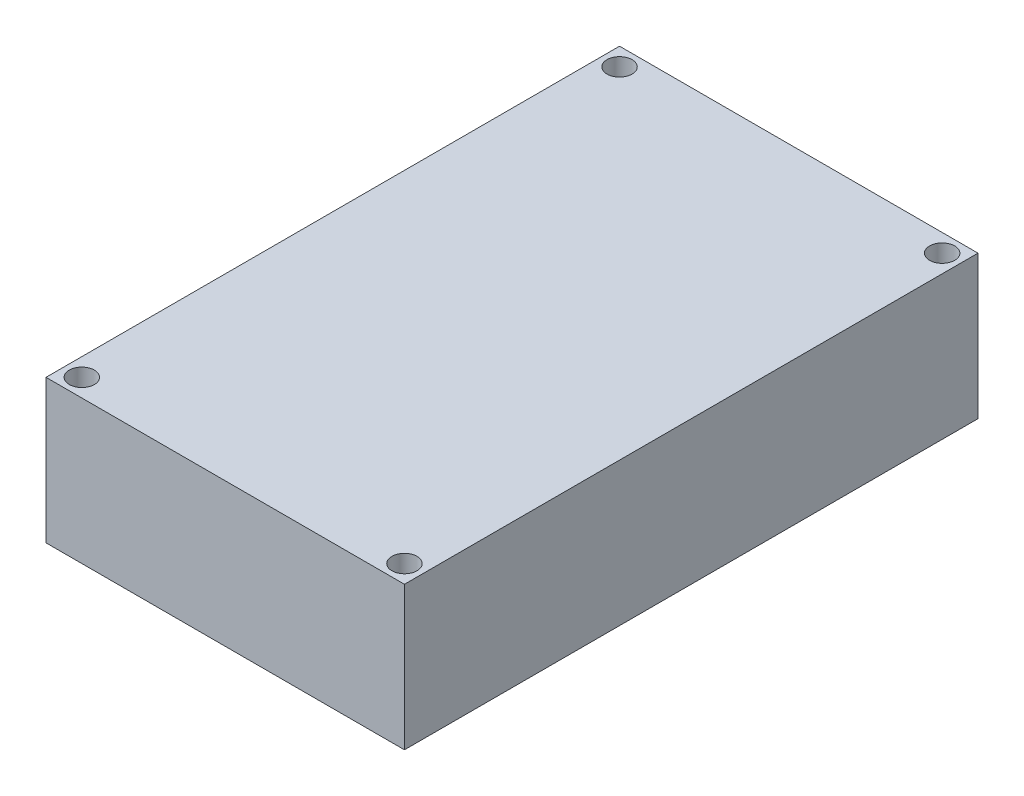
ISO-10303-21;
HEADER;
FILE_DESCRIPTION(('STEP AP214'),'2;1');
FILE_NAME('part.step','',(''),(''),'','','');
FILE_SCHEMA(('AUTOMOTIVE_DESIGN { 1 0 10303 214 1 1 1 1 }'));
ENDSEC;
DATA;
#1=APPLICATION_CONTEXT('core data for automotive mechanical design processes');
#2=APPLICATION_PROTOCOL_DEFINITION('international standard','automotive_design',2000,#1);
#3=PRODUCT_CONTEXT('',#1,'mechanical');
#4=PRODUCT('Part','Part','',(#3));
#5=PRODUCT_RELATED_PRODUCT_CATEGORY('part','',(#4));
#6=PRODUCT_DEFINITION_FORMATION('','',#4);
#7=PRODUCT_DEFINITION_CONTEXT('part definition',#1,'design');
#8=PRODUCT_DEFINITION('design','',#6,#7);
#9=PRODUCT_DEFINITION_SHAPE('','',#8);
#10=(LENGTH_UNIT() NAMED_UNIT(*) SI_UNIT(.MILLI.,.METRE.));
#11=(NAMED_UNIT(*) PLANE_ANGLE_UNIT() SI_UNIT($,.RADIAN.));
#12=(NAMED_UNIT(*) SI_UNIT($,.STERADIAN.) SOLID_ANGLE_UNIT());
#13=UNCERTAINTY_MEASURE_WITH_UNIT(LENGTH_MEASURE(1.E-05),#10,'distance_accuracy_value','');
#14=(GEOMETRIC_REPRESENTATION_CONTEXT(3) GLOBAL_UNCERTAINTY_ASSIGNED_CONTEXT((#13)) GLOBAL_UNIT_ASSIGNED_CONTEXT((#10,
#11,#12)) REPRESENTATION_CONTEXT('',''));
#15=CARTESIAN_POINT('',(0.,0.,0.));
#16=DIRECTION('',(0.,0.,1.));
#17=DIRECTION('',(1.,0.,0.));
#18=AXIS2_PLACEMENT_3D('',#15,#16,#17);
#19=CARTESIAN_POINT('',(0.,20.,0.));
#20=DIRECTION('',(0.,1.,0.));
#21=DIRECTION('',(0.,0.,1.));
#22=AXIS2_PLACEMENT_3D('',#19,#20,#21);
#23=PLANE('',#22);
#24=CARTESIAN_POINT('',(-4.05936675461743,20.,54.6031662269129));
#25=DIRECTION('',(0.,1.,0.));
#26=DIRECTION('',(0.,0.,1.));
#27=AXIS2_PLACEMENT_3D('',#24,#25,#26);
#28=CIRCLE('',#27,1.75);
#29=CARTESIAN_POINT('',(-4.05936675461743,20.,56.3531662269129));
#30=VERTEX_POINT('',#29);
#31=EDGE_CURVE('E124',#30,#30,#28,.T.);
#32=ORIENTED_EDGE('',*,*,#31,.F.);
#33=EDGE_LOOP('',(#32));
#34=FACE_BOUND('',#33,.T.);
#35=CARTESIAN_POINT('',(40.9406332453826,20.,-20.3968337730871));
#36=DIRECTION('',(0.,1.,0.));
#37=DIRECTION('',(0.,0.,1.));
#38=AXIS2_PLACEMENT_3D('',#35,#36,#37);
#39=CIRCLE('',#38,1.75);
#40=CARTESIAN_POINT('',(40.9406332453826,20.,-18.6468337730871));
#41=VERTEX_POINT('',#40);
#42=EDGE_CURVE('E103',#41,#41,#39,.T.);
#43=ORIENTED_EDGE('',*,*,#42,.F.);
#44=EDGE_LOOP('',(#43));
#45=FACE_BOUND('',#44,.T.);
#46=DIRECTION('',(0.,0.,1.));
#47=VECTOR('',#46,1.);
#48=CARTESIAN_POINT('',(-6.55936675461744,20.,-22.8968337730871));
#49=LINE('',#48,#47);
#50=CARTESIAN_POINT('',(-6.55936675461744,20.,-22.8968337730871));
#51=VERTEX_POINT('',#50);
#52=CARTESIAN_POINT('',(-6.55936675461743,20.,57.1031662269129));
#53=VERTEX_POINT('',#52);
#54=EDGE_CURVE('E88',#51,#53,#49,.T.);
#55=ORIENTED_EDGE('',*,*,#54,.T.);
#56=DIRECTION('',(1.,0.,0.));
#57=VECTOR('',#56,1.);
#58=CARTESIAN_POINT('',(-6.55936675461743,20.,57.1031662269129));
#59=LINE('',#58,#57);
#60=CARTESIAN_POINT('',(43.4406332453826,20.,57.1031662269129));
#61=VERTEX_POINT('',#60);
#62=EDGE_CURVE('E83',#53,#61,#59,.T.);
#63=ORIENTED_EDGE('',*,*,#62,.T.);
#64=DIRECTION('',(0.,0.,-1.));
#65=VECTOR('',#64,1.);
#66=CARTESIAN_POINT('',(43.4406332453826,20.,-22.8968337730871));
#67=LINE('',#66,#65);
#68=CARTESIAN_POINT('',(43.4406332453826,20.,-22.8968337730871));
#69=VERTEX_POINT('',#68);
#70=EDGE_CURVE('E86',#61,#69,#67,.T.);
#71=ORIENTED_EDGE('',*,*,#70,.T.);
#72=DIRECTION('',(-1.,0.,0.));
#73=VECTOR('',#72,1.);
#74=CARTESIAN_POINT('',(-6.55936675461744,20.,-22.8968337730871));
#75=LINE('',#74,#73);
#76=EDGE_CURVE('E53',#69,#51,#75,.T.);
#77=ORIENTED_EDGE('',*,*,#76,.T.);
#78=EDGE_LOOP('',(#55,#63,#71,#77));
#79=FACE_BOUND('',#78,.T.);
#80=CARTESIAN_POINT('',(-4.05936675461743,20.,-20.3968337730871));
#81=DIRECTION('',(0.,1.,0.));
#82=DIRECTION('',(0.,0.,1.));
#83=AXIS2_PLACEMENT_3D('',#80,#81,#82);
#84=CIRCLE('',#83,1.75);
#85=CARTESIAN_POINT('',(-4.05936675461743,20.,-18.6468337730871));
#86=VERTEX_POINT('',#85);
#87=EDGE_CURVE('E118',#86,#86,#84,.T.);
#88=ORIENTED_EDGE('',*,*,#87,.F.);
#89=EDGE_LOOP('',(#88));
#90=FACE_BOUND('',#89,.T.);
#91=CARTESIAN_POINT('',(40.9406332453826,20.,54.6031662269129));
#92=DIRECTION('',(0.,1.,0.));
#93=DIRECTION('',(0.,0.,1.));
#94=AXIS2_PLACEMENT_3D('',#91,#92,#93);
#95=CIRCLE('',#94,1.75);
#96=CARTESIAN_POINT('',(40.9406332453826,20.,56.3531662269129));
#97=VERTEX_POINT('',#96);
#98=EDGE_CURVE('E130',#97,#97,#95,.T.);
#99=ORIENTED_EDGE('',*,*,#98,.F.);
#100=EDGE_LOOP('',(#99));
#101=FACE_BOUND('',#100,.T.);
#102=ADVANCED_FACE('F36',(#34,#45,#79,#90,#101),#23,.T.);
#103=CARTESIAN_POINT('',(0.,0.,0.));
#104=DIRECTION('',(0.,1.,0.));
#105=DIRECTION('',(0.,0.,1.));
#106=AXIS2_PLACEMENT_3D('',#103,#104,#105);
#107=PLANE('',#106);
#108=DIRECTION('',(0.,0.,1.));
#109=VECTOR('',#108,1.);
#110=CARTESIAN_POINT('',(-6.55936675461744,0.,-22.8968337730871));
#111=LINE('',#110,#109);
#112=CARTESIAN_POINT('',(-6.55936675461744,0.,-22.8968337730871));
#113=VERTEX_POINT('',#112);
#114=CARTESIAN_POINT('',(-6.55936675461743,0.,57.1031662269129));
#115=VERTEX_POINT('',#114);
#116=EDGE_CURVE('E100',#113,#115,#111,.T.);
#117=ORIENTED_EDGE('',*,*,#116,.F.);
#118=DIRECTION('',(-1.,0.,0.));
#119=VECTOR('',#118,1.);
#120=CARTESIAN_POINT('',(-6.55936675461744,0.,-22.8968337730871));
#121=LINE('',#120,#119);
#122=CARTESIAN_POINT('',(43.4406332453826,0.,-22.8968337730871));
#123=VERTEX_POINT('',#122);
#124=EDGE_CURVE('E76',#123,#113,#121,.T.);
#125=ORIENTED_EDGE('',*,*,#124,.F.);
#126=DIRECTION('',(0.,0.,-1.));
#127=VECTOR('',#126,1.);
#128=CARTESIAN_POINT('',(43.4406332453826,0.,-22.8968337730871));
#129=LINE('',#128,#127);
#130=CARTESIAN_POINT('',(43.4406332453826,0.,57.1031662269129));
#131=VERTEX_POINT('',#130);
#132=EDGE_CURVE('E70',#131,#123,#129,.T.);
#133=ORIENTED_EDGE('',*,*,#132,.F.);
#134=DIRECTION('',(1.,0.,0.));
#135=VECTOR('',#134,1.);
#136=CARTESIAN_POINT('',(-6.55936675461743,0.,57.1031662269129));
#137=LINE('',#136,#135);
#138=EDGE_CURVE('E92',#115,#131,#137,.T.);
#139=ORIENTED_EDGE('',*,*,#138,.F.);
#140=EDGE_LOOP('',(#117,#125,#133,#139));
#141=FACE_BOUND('',#140,.T.);
#142=CARTESIAN_POINT('',(40.9406332453826,0.,-20.3968337730871));
#143=DIRECTION('',(0.,1.,0.));
#144=DIRECTION('',(0.,0.,1.));
#145=AXIS2_PLACEMENT_3D('',#142,#143,#144);
#146=CIRCLE('',#145,1.75);
#147=CARTESIAN_POINT('',(40.9406332453826,0.,-18.6468337730871));
#148=VERTEX_POINT('',#147);
#149=EDGE_CURVE('E115',#148,#148,#146,.T.);
#150=ORIENTED_EDGE('',*,*,#149,.T.);
#151=EDGE_LOOP('',(#150));
#152=FACE_BOUND('',#151,.T.);
#153=CARTESIAN_POINT('',(-4.05936675461743,0.,-20.3968337730871));
#154=DIRECTION('',(0.,1.,0.));
#155=DIRECTION('',(0.,0.,1.));
#156=AXIS2_PLACEMENT_3D('',#153,#154,#155);
#157=CIRCLE('',#156,1.75);
#158=CARTESIAN_POINT('',(-4.05936675461743,0.,-18.6468337730871));
#159=VERTEX_POINT('',#158);
#160=EDGE_CURVE('E121',#159,#159,#157,.T.);
#161=ORIENTED_EDGE('',*,*,#160,.T.);
#162=EDGE_LOOP('',(#161));
#163=FACE_BOUND('',#162,.T.);
#164=CARTESIAN_POINT('',(-4.05936675461743,0.,54.6031662269129));
#165=DIRECTION('',(0.,1.,0.));
#166=DIRECTION('',(0.,0.,1.));
#167=AXIS2_PLACEMENT_3D('',#164,#165,#166);
#168=CIRCLE('',#167,1.75);
#169=CARTESIAN_POINT('',(-4.05936675461743,0.,56.3531662269129));
#170=VERTEX_POINT('',#169);
#171=EDGE_CURVE('E127',#170,#170,#168,.T.);
#172=ORIENTED_EDGE('',*,*,#171,.T.);
#173=EDGE_LOOP('',(#172));
#174=FACE_BOUND('',#173,.T.);
#175=CARTESIAN_POINT('',(40.9406332453826,0.,54.6031662269129));
#176=DIRECTION('',(0.,1.,0.));
#177=DIRECTION('',(0.,0.,1.));
#178=AXIS2_PLACEMENT_3D('',#175,#176,#177);
#179=CIRCLE('',#178,1.75);
#180=CARTESIAN_POINT('',(40.9406332453826,0.,56.3531662269129));
#181=VERTEX_POINT('',#180);
#182=EDGE_CURVE('E133',#181,#181,#179,.T.);
#183=ORIENTED_EDGE('',*,*,#182,.T.);
#184=EDGE_LOOP('',(#183));
#185=FACE_BOUND('',#184,.T.);
#186=ADVANCED_FACE('F111',(#141,#152,#163,#174,#185),#107,.F.);
#187=CARTESIAN_POINT('',(-6.55936675461744,20.,-22.8968337730871));
#188=DIRECTION('',(1.,0.,0.));
#189=DIRECTION('',(0.,0.,-1.));
#190=AXIS2_PLACEMENT_3D('',#187,#188,#189);
#191=PLANE('',#190);
#192=ORIENTED_EDGE('',*,*,#116,.T.);
#193=DIRECTION('',(0.,-1.,0.));
#194=VECTOR('',#193,1.);
#195=CARTESIAN_POINT('',(-6.55936675461743,20.,57.1031662269129));
#196=LINE('',#195,#194);
#197=EDGE_CURVE('E11',#53,#115,#196,.T.);
#198=ORIENTED_EDGE('',*,*,#197,.F.);
#199=ORIENTED_EDGE('',*,*,#54,.F.);
#200=DIRECTION('',(0.,-1.,0.));
#201=VECTOR('',#200,1.);
#202=CARTESIAN_POINT('',(-6.55936675461744,20.,-22.8968337730871));
#203=LINE('',#202,#201);
#204=EDGE_CURVE('E96',#51,#113,#203,.T.);
#205=ORIENTED_EDGE('',*,*,#204,.T.);
#206=EDGE_LOOP('',(#192,#198,#199,#205));
#207=FACE_BOUND('',#206,.T.);
#208=ADVANCED_FACE('F38',(#207),#191,.F.);
#209=CARTESIAN_POINT('',(-6.55936675461743,20.,57.1031662269129));
#210=DIRECTION('',(0.,0.,-1.));
#211=DIRECTION('',(-1.,0.,0.));
#212=AXIS2_PLACEMENT_3D('',#209,#210,#211);
#213=PLANE('',#212);
#214=ORIENTED_EDGE('',*,*,#138,.T.);
#215=DIRECTION('',(0.,-1.,0.));
#216=VECTOR('',#215,1.);
#217=CARTESIAN_POINT('',(43.4406332453826,20.,57.1031662269129));
#218=LINE('',#217,#216);
#219=EDGE_CURVE('E45',#61,#131,#218,.T.);
#220=ORIENTED_EDGE('',*,*,#219,.F.);
#221=ORIENTED_EDGE('',*,*,#62,.F.);
#222=ORIENTED_EDGE('',*,*,#197,.T.);
#223=EDGE_LOOP('',(#214,#220,#221,#222));
#224=FACE_BOUND('',#223,.T.);
#225=ADVANCED_FACE('F91',(#224),#213,.F.);
#226=CARTESIAN_POINT('',(43.4406332453826,20.,-22.8968337730871));
#227=DIRECTION('',(-1.,0.,0.));
#228=DIRECTION('',(0.,0.,1.));
#229=AXIS2_PLACEMENT_3D('',#226,#227,#228);
#230=PLANE('',#229);
#231=ORIENTED_EDGE('',*,*,#132,.T.);
#232=DIRECTION('',(0.,-1.,0.));
#233=VECTOR('',#232,1.);
#234=CARTESIAN_POINT('',(43.4406332453826,20.,-22.8968337730871));
#235=LINE('',#234,#233);
#236=EDGE_CURVE('E93',#69,#123,#235,.T.);
#237=ORIENTED_EDGE('',*,*,#236,.F.);
#238=ORIENTED_EDGE('',*,*,#70,.F.);
#239=ORIENTED_EDGE('',*,*,#219,.T.);
#240=EDGE_LOOP('',(#231,#237,#238,#239));
#241=FACE_BOUND('',#240,.T.);
#242=ADVANCED_FACE('F94',(#241),#230,.F.);
#243=CARTESIAN_POINT('',(-6.55936675461744,20.,-22.8968337730871));
#244=DIRECTION('',(0.,0.,1.));
#245=DIRECTION('',(1.,0.,0.));
#246=AXIS2_PLACEMENT_3D('',#243,#244,#245);
#247=PLANE('',#246);
#248=ORIENTED_EDGE('',*,*,#124,.T.);
#249=ORIENTED_EDGE('',*,*,#204,.F.);
#250=ORIENTED_EDGE('',*,*,#76,.F.);
#251=ORIENTED_EDGE('',*,*,#236,.T.);
#252=EDGE_LOOP('',(#248,#249,#250,#251));
#253=FACE_BOUND('',#252,.T.);
#254=ADVANCED_FACE('F108',(#253),#247,.F.);
#255=CARTESIAN_POINT('',(40.9406332453826,20.,-20.3968337730871));
#256=DIRECTION('',(0.,-1.,0.));
#257=DIRECTION('',(0.,0.,-1.));
#258=AXIS2_PLACEMENT_3D('',#255,#256,#257);
#259=CYLINDRICAL_SURFACE('',#258,1.75);
#260=ORIENTED_EDGE('',*,*,#42,.T.);
#261=EDGE_LOOP('',(#260));
#262=FACE_BOUND('',#261,.T.);
#263=ORIENTED_EDGE('',*,*,#149,.F.);
#264=EDGE_LOOP('',(#263));
#265=FACE_BOUND('',#264,.T.);
#266=ADVANCED_FACE('F152',(#262,#265),#259,.F.);
#267=CARTESIAN_POINT('',(-4.05936675461743,20.,-20.3968337730871));
#268=DIRECTION('',(0.,-1.,0.));
#269=DIRECTION('',(0.,0.,-1.));
#270=AXIS2_PLACEMENT_3D('',#267,#268,#269);
#271=CYLINDRICAL_SURFACE('',#270,1.75);
#272=ORIENTED_EDGE('',*,*,#87,.T.);
#273=EDGE_LOOP('',(#272));
#274=FACE_BOUND('',#273,.T.);
#275=ORIENTED_EDGE('',*,*,#160,.F.);
#276=EDGE_LOOP('',(#275));
#277=FACE_BOUND('',#276,.T.);
#278=ADVANCED_FACE('F198',(#274,#277),#271,.F.);
#279=CARTESIAN_POINT('',(-4.05936675461743,20.,54.6031662269129));
#280=DIRECTION('',(0.,-1.,0.));
#281=DIRECTION('',(0.,0.,-1.));
#282=AXIS2_PLACEMENT_3D('',#279,#280,#281);
#283=CYLINDRICAL_SURFACE('',#282,1.75);
#284=ORIENTED_EDGE('',*,*,#31,.T.);
#285=EDGE_LOOP('',(#284));
#286=FACE_BOUND('',#285,.T.);
#287=ORIENTED_EDGE('',*,*,#171,.F.);
#288=EDGE_LOOP('',(#287));
#289=FACE_BOUND('',#288,.T.);
#290=ADVANCED_FACE('F206',(#286,#289),#283,.F.);
#291=CARTESIAN_POINT('',(40.9406332453826,20.,54.6031662269129));
#292=DIRECTION('',(0.,-1.,0.));
#293=DIRECTION('',(0.,0.,-1.));
#294=AXIS2_PLACEMENT_3D('',#291,#292,#293);
#295=CYLINDRICAL_SURFACE('',#294,1.75);
#296=ORIENTED_EDGE('',*,*,#98,.T.);
#297=EDGE_LOOP('',(#296));
#298=FACE_BOUND('',#297,.T.);
#299=ORIENTED_EDGE('',*,*,#182,.F.);
#300=EDGE_LOOP('',(#299));
#301=FACE_BOUND('',#300,.T.);
#302=ADVANCED_FACE('F139',(#298,#301),#295,.F.);
#303=CLOSED_SHELL('',(#102,#186,#208,#225,#242,#254,#266,#278,#290,#302));
#304=MANIFOLD_SOLID_BREP('B2',#303);
#305=ADVANCED_BREP_SHAPE_REPRESENTATION('',(#18,#304),#14);
#306=SHAPE_DEFINITION_REPRESENTATION(#9,#305);
ENDSEC;
END-ISO-10303-21;
